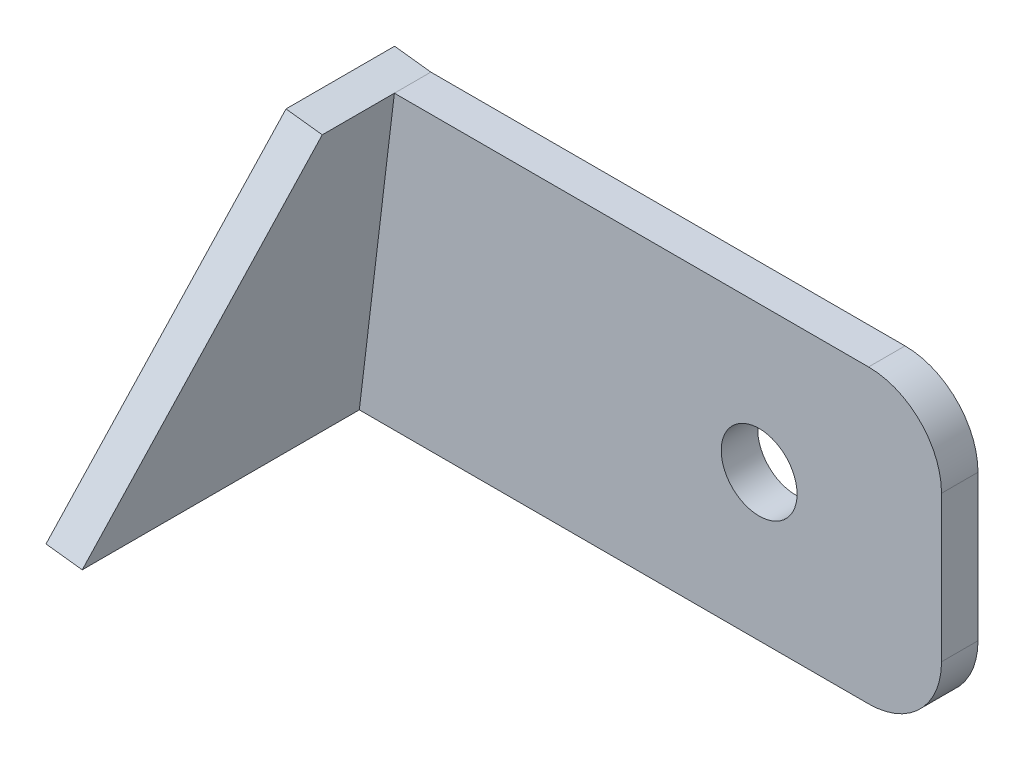
ISO-10303-21;
HEADER;
FILE_DESCRIPTION(('STEP AP214'),'2;1');
FILE_NAME('part.step','',(''),(''),'','','');
FILE_SCHEMA(('AUTOMOTIVE_DESIGN { 1 0 10303 214 1 1 1 1 }'));
ENDSEC;
DATA;
#1=APPLICATION_CONTEXT('core data for automotive mechanical design processes');
#2=APPLICATION_PROTOCOL_DEFINITION('international standard','automotive_design',2000,#1);
#3=PRODUCT_CONTEXT('',#1,'mechanical');
#4=PRODUCT('Part','Part','',(#3));
#5=PRODUCT_RELATED_PRODUCT_CATEGORY('part','',(#4));
#6=PRODUCT_DEFINITION_FORMATION('','',#4);
#7=PRODUCT_DEFINITION_CONTEXT('part definition',#1,'design');
#8=PRODUCT_DEFINITION('design','',#6,#7);
#9=PRODUCT_DEFINITION_SHAPE('','',#8);
#10=(LENGTH_UNIT() NAMED_UNIT(*) SI_UNIT(.MILLI.,.METRE.));
#11=(NAMED_UNIT(*) PLANE_ANGLE_UNIT() SI_UNIT($,.RADIAN.));
#12=(NAMED_UNIT(*) SI_UNIT($,.STERADIAN.) SOLID_ANGLE_UNIT());
#13=UNCERTAINTY_MEASURE_WITH_UNIT(LENGTH_MEASURE(1.E-05),#10,'distance_accuracy_value','');
#14=(GEOMETRIC_REPRESENTATION_CONTEXT(3) GLOBAL_UNCERTAINTY_ASSIGNED_CONTEXT((#13)) GLOBAL_UNIT_ASSIGNED_CONTEXT((#10,
#11,#12)) REPRESENTATION_CONTEXT('',''));
#15=CARTESIAN_POINT('',(0.,0.,0.));
#16=DIRECTION('',(0.,0.,1.));
#17=DIRECTION('',(1.,0.,0.));
#18=AXIS2_PLACEMENT_3D('',#15,#16,#17);
#19=CARTESIAN_POINT('',(-6.20358605111973,-12.3213163244714,0.));
#20=DIRECTION('',(0.119270448985395,0.992861803071718,0.));
#21=DIRECTION('',(-0.992861803071718,0.119270448985395,0.));
#22=AXIS2_PLACEMENT_3D('',#19,#20,#21);
#23=PLANE('',#22);
#24=DIRECTION('',(0.,0.,1.));
#25=VECTOR('',#24,1.);
#26=CARTESIAN_POINT('',(-3.05124982636702,-12.7,0.));
#27=LINE('',#26,#25);
#28=CARTESIAN_POINT('',(-3.05124982636702,-12.7,0.));
#29=VERTEX_POINT('',#28);
#30=CARTESIAN_POINT('',(-3.05124982636702,-12.7,27.2953089126241));
#31=VERTEX_POINT('',#30);
#32=EDGE_CURVE('E209',#29,#31,#27,.T.);
#33=ORIENTED_EDGE('',*,*,#32,.T.);
#34=DIRECTION('',(0.992861803071718,-0.119270448985395,0.));
#35=VECTOR('',#34,1.);
#36=CARTESIAN_POINT('',(-6.20358605111973,-12.3213163244714,27.2953089126241));
#37=LINE('',#36,#35);
#38=CARTESIAN_POINT('',(-6.20358605111973,-12.3213163244714,27.2953089126241));
#39=VERTEX_POINT('',#38);
#40=EDGE_CURVE('E13',#39,#31,#37,.T.);
#41=ORIENTED_EDGE('',*,*,#40,.F.);
#42=DIRECTION('',(0.,0.,1.));
#43=VECTOR('',#42,1.);
#44=CARTESIAN_POINT('',(-6.20358605111973,-12.3213163244714,0.));
#45=LINE('',#44,#43);
#46=CARTESIAN_POINT('',(-6.20358605111973,-12.3213163244714,0.));
#47=VERTEX_POINT('',#46);
#48=EDGE_CURVE('E115',#47,#39,#45,.T.);
#49=ORIENTED_EDGE('',*,*,#48,.F.);
#50=DIRECTION('',(0.992861803071718,-0.119270448985395,0.));
#51=VECTOR('',#50,1.);
#52=CARTESIAN_POINT('',(-6.20358605111973,-12.3213163244714,0.));
#53=LINE('',#52,#51);
#54=EDGE_CURVE('E153',#47,#29,#53,.T.);
#55=ORIENTED_EDGE('',*,*,#54,.T.);
#56=EDGE_LOOP('',(#33,#41,#49,#55));
#57=FACE_BOUND('',#56,.T.);
#58=ADVANCED_FACE('F59',(#57),#23,.F.);
#59=CARTESIAN_POINT('',(-3.63508992450489,9.06002094009953,12.276588008054));
#60=DIRECTION('',(0.0682268201061862,0.567951275481261,0.820229510379508));
#61=DIRECTION('',(0.,-0.822145243895806,0.569277786269151));
#62=AXIS2_PLACEMENT_3D('',#59,#60,#61);
#63=PLANE('',#62);
#64=DIRECTION('',(-0.0978291419740346,-0.81437455060803,0.572034570898117));
#65=VECTOR('',#64,1.);
#66=CARTESIAN_POINT('',(-0.482753699752187,8.6813372645709,12.276588008054));
#67=LINE('',#66,#65);
#68=CARTESIAN_POINT('',(0.,12.7,9.45379103861392));
#69=VERTEX_POINT('',#68);
#70=EDGE_CURVE('E204',#69,#31,#67,.T.);
#71=ORIENTED_EDGE('',*,*,#70,.F.);
#72=DIRECTION('',(0.992861803071718,-0.119270448985395,0.));
#73=VECTOR('',#72,1.);
#74=CARTESIAN_POINT('',(-3.1523362247527,13.0786836755286,9.45379103861392));
#75=LINE('',#74,#73);
#76=CARTESIAN_POINT('',(-3.1523362247527,13.0786836755286,9.45379103861392));
#77=VERTEX_POINT('',#76);
#78=EDGE_CURVE('E67',#77,#69,#75,.T.);
#79=ORIENTED_EDGE('',*,*,#78,.F.);
#80=DIRECTION('',(-0.0978291419740346,-0.81437455060803,0.572034570898117));
#81=VECTOR('',#80,1.);
#82=CARTESIAN_POINT('',(-3.63508992450489,9.06002094009953,12.276588008054));
#83=LINE('',#82,#81);
#84=EDGE_CURVE('E175',#77,#39,#83,.T.);
#85=ORIENTED_EDGE('',*,*,#84,.T.);
#86=ORIENTED_EDGE('',*,*,#40,.T.);
#87=EDGE_LOOP('',(#71,#79,#85,#86));
#88=FACE_BOUND('',#87,.T.);
#89=ADVANCED_FACE('F205',(#88),#63,.T.);
#90=CARTESIAN_POINT('',(-3.1523362247527,13.0786836755286,0.));
#91=DIRECTION('',(0.119270448985395,0.992861803071718,0.));
#92=DIRECTION('',(-0.992861803071718,0.119270448985395,0.));
#93=AXIS2_PLACEMENT_3D('',#90,#91,#92);
#94=PLANE('',#93);
#95=DIRECTION('',(0.,0.,1.));
#96=VECTOR('',#95,1.);
#97=CARTESIAN_POINT('',(0.,12.7,0.));
#98=LINE('',#97,#96);
#99=CARTESIAN_POINT('',(0.,12.7,0.));
#100=VERTEX_POINT('',#99);
#101=EDGE_CURVE('E200',#100,#69,#98,.T.);
#102=ORIENTED_EDGE('',*,*,#101,.F.);
#103=DIRECTION('',(0.992861803071718,-0.119270448985395,0.));
#104=VECTOR('',#103,1.);
#105=CARTESIAN_POINT('',(-3.1523362247527,13.0786836755286,0.));
#106=LINE('',#105,#104);
#107=CARTESIAN_POINT('',(-3.1523362247527,13.0786836755286,0.));
#108=VERTEX_POINT('',#107);
#109=EDGE_CURVE('E194',#108,#100,#106,.T.);
#110=ORIENTED_EDGE('',*,*,#109,.F.);
#111=DIRECTION('',(0.,0.,1.));
#112=VECTOR('',#111,1.);
#113=CARTESIAN_POINT('',(-3.1523362247527,13.0786836755286,0.));
#114=LINE('',#113,#112);
#115=EDGE_CURVE('E170',#108,#77,#114,.T.);
#116=ORIENTED_EDGE('',*,*,#115,.T.);
#117=ORIENTED_EDGE('',*,*,#78,.T.);
#118=EDGE_LOOP('',(#102,#110,#116,#117));
#119=FACE_BOUND('',#118,.T.);
#120=ADVANCED_FACE('F198',(#119),#94,.T.);
#121=CARTESIAN_POINT('',(-4.65625845226942,0.559346763543585,0.));
#122=DIRECTION('',(0.,0.,1.));
#123=DIRECTION('',(1.,0.,0.));
#124=AXIS2_PLACEMENT_3D('',#121,#122,#123);
#125=PLANE('',#124);
#126=DIRECTION('',(-0.119270448985395,-0.992861803071718,0.));
#127=VECTOR('',#126,1.);
#128=CARTESIAN_POINT('',(-1.50392222751671,0.180663088014956,0.));
#129=LINE('',#128,#127);
#130=CARTESIAN_POINT('',(-0.764941024567826,6.33228082599954,0.));
#131=VERTEX_POINT('',#130);
#132=EDGE_CURVE('E214',#100,#131,#129,.T.);
#133=ORIENTED_EDGE('',*,*,#132,.T.);
#134=DIRECTION('',(0.992861803071718,-0.119270448985395,0.));
#135=VECTOR('',#134,1.);
#136=CARTESIAN_POINT('',(-3.91727724932053,6.71096450152817,0.));
#137=LINE('',#136,#135);
#138=CARTESIAN_POINT('',(-3.91727724932053,6.71096450152817,0.));
#139=VERTEX_POINT('',#138);
#140=EDGE_CURVE('E191',#139,#131,#137,.T.);
#141=ORIENTED_EDGE('',*,*,#140,.F.);
#142=DIRECTION('',(-0.119270448985395,-0.992861803071718,0.));
#143=VECTOR('',#142,1.);
#144=CARTESIAN_POINT('',(-4.65625845226942,0.559346763543585,0.));
#145=LINE('',#144,#143);
#146=EDGE_CURVE('E166',#108,#139,#145,.T.);
#147=ORIENTED_EDGE('',*,*,#146,.F.);
#148=ORIENTED_EDGE('',*,*,#109,.T.);
#149=EDGE_LOOP('',(#133,#141,#147,#148));
#150=FACE_BOUND('',#149,.T.);
#151=ADVANCED_FACE('F240',(#150),#125,.F.);
#152=CARTESIAN_POINT('',(-3.91727724932053,6.71096450152817,0.));
#153=DIRECTION('',(0.119270448985395,0.992861803071718,0.));
#154=DIRECTION('',(-0.992861803071718,0.119270448985395,0.));
#155=AXIS2_PLACEMENT_3D('',#152,#153,#154);
#156=PLANE('',#155);
#157=DIRECTION('',(0.,0.,1.));
#158=VECTOR('',#157,1.);
#159=CARTESIAN_POINT('',(-0.764941024567826,6.33228082599954,0.));
#160=LINE('',#159,#158);
#161=CARTESIAN_POINT('',(-0.764941024567826,6.33228082599954,3.175));
#162=VERTEX_POINT('',#161);
#163=EDGE_CURVE('E216',#131,#162,#160,.T.);
#164=ORIENTED_EDGE('',*,*,#163,.T.);
#165=DIRECTION('',(0.992861803071718,-0.119270448985395,0.));
#166=VECTOR('',#165,1.);
#167=CARTESIAN_POINT('',(-3.91727724932053,6.71096450152817,3.175));
#168=LINE('',#167,#166);
#169=CARTESIAN_POINT('',(-3.91727724932053,6.71096450152817,3.175));
#170=VERTEX_POINT('',#169);
#171=EDGE_CURVE('E146',#170,#162,#168,.T.);
#172=ORIENTED_EDGE('',*,*,#171,.F.);
#173=DIRECTION('',(0.,0.,1.));
#174=VECTOR('',#173,1.);
#175=CARTESIAN_POINT('',(-3.91727724932053,6.71096450152817,0.));
#176=LINE('',#175,#174);
#177=EDGE_CURVE('E136',#139,#170,#176,.T.);
#178=ORIENTED_EDGE('',*,*,#177,.F.);
#179=ORIENTED_EDGE('',*,*,#140,.T.);
#180=EDGE_LOOP('',(#164,#172,#178,#179));
#181=FACE_BOUND('',#180,.T.);
#182=ADVANCED_FACE('F220',(#181),#156,.F.);
#183=CARTESIAN_POINT('',(-4.65625845226942,0.559346763543586,3.175));
#184=DIRECTION('',(0.,0.,1.));
#185=DIRECTION('',(0.,-1.,0.));
#186=AXIS2_PLACEMENT_3D('',#183,#184,#185);
#187=PLANE('',#186);
#188=DIRECTION('',(-0.119270448985395,-0.992861803071718,0.));
#189=VECTOR('',#188,1.);
#190=CARTESIAN_POINT('',(-1.50392222751671,0.180663088014957,3.175));
#191=LINE('',#190,#189);
#192=CARTESIAN_POINT('',(-2.28630880179919,-6.33228082599955,3.175));
#193=VERTEX_POINT('',#192);
#194=EDGE_CURVE('E145',#162,#193,#191,.T.);
#195=ORIENTED_EDGE('',*,*,#194,.T.);
#196=DIRECTION('',(0.992861803071718,-0.119270448985395,0.));
#197=VECTOR('',#196,1.);
#198=CARTESIAN_POINT('',(-5.4386450265519,-5.95359715047092,3.175));
#199=LINE('',#198,#197);
#200=CARTESIAN_POINT('',(-5.4386450265519,-5.95359715047092,3.175));
#201=VERTEX_POINT('',#200);
#202=EDGE_CURVE('E142',#201,#193,#199,.T.);
#203=ORIENTED_EDGE('',*,*,#202,.F.);
#204=DIRECTION('',(-0.119270448985395,-0.992861803071718,0.));
#205=VECTOR('',#204,1.);
#206=CARTESIAN_POINT('',(-4.65625845226942,0.559346763543586,3.175));
#207=LINE('',#206,#205);
#208=EDGE_CURVE('E130',#170,#201,#207,.T.);
#209=ORIENTED_EDGE('',*,*,#208,.F.);
#210=ORIENTED_EDGE('',*,*,#171,.T.);
#211=EDGE_LOOP('',(#195,#203,#209,#210));
#212=FACE_BOUND('',#211,.T.);
#213=ADVANCED_FACE('F143',(#212),#187,.F.);
#214=CARTESIAN_POINT('',(-5.4386450265519,-5.95359715047091,0.));
#215=DIRECTION('',(-0.119270448985395,-0.992861803071718,0.));
#216=DIRECTION('',(0.992861803071718,-0.119270448985395,0.));
#217=AXIS2_PLACEMENT_3D('',#214,#215,#216);
#218=PLANE('',#217);
#219=DIRECTION('',(0.,0.,-1.));
#220=VECTOR('',#219,1.);
#221=CARTESIAN_POINT('',(-2.28630880179919,-6.33228082599954,0.));
#222=LINE('',#221,#220);
#223=CARTESIAN_POINT('',(-2.28630880179919,-6.33228082599954,0.));
#224=VERTEX_POINT('',#223);
#225=EDGE_CURVE('E103',#193,#224,#222,.T.);
#226=ORIENTED_EDGE('',*,*,#225,.T.);
#227=DIRECTION('',(0.992861803071718,-0.119270448985395,0.));
#228=VECTOR('',#227,1.);
#229=CARTESIAN_POINT('',(-5.4386450265519,-5.95359715047092,0.));
#230=LINE('',#229,#228);
#231=CARTESIAN_POINT('',(-5.4386450265519,-5.95359715047092,0.));
#232=VERTEX_POINT('',#231);
#233=EDGE_CURVE('E147',#232,#224,#230,.T.);
#234=ORIENTED_EDGE('',*,*,#233,.F.);
#235=DIRECTION('',(0.,0.,-1.));
#236=VECTOR('',#235,1.);
#237=CARTESIAN_POINT('',(-5.4386450265519,-5.95359715047091,0.));
#238=LINE('',#237,#236);
#239=EDGE_CURVE('E134',#201,#232,#238,.T.);
#240=ORIENTED_EDGE('',*,*,#239,.F.);
#241=ORIENTED_EDGE('',*,*,#202,.T.);
#242=EDGE_LOOP('',(#226,#234,#240,#241));
#243=FACE_BOUND('',#242,.T.);
#244=ADVANCED_FACE('F149',(#243),#218,.F.);
#245=CARTESIAN_POINT('',(-4.65625845226942,0.559346763543585,0.));
#246=DIRECTION('',(0.,0.,1.));
#247=DIRECTION('',(1.,0.,0.));
#248=AXIS2_PLACEMENT_3D('',#245,#246,#247);
#249=PLANE('',#248);
#250=DIRECTION('',(-0.119270448985395,-0.992861803071718,0.));
#251=VECTOR('',#250,1.);
#252=CARTESIAN_POINT('',(-1.50392222751671,0.180663088014956,0.));
#253=LINE('',#252,#251);
#254=EDGE_CURVE('E109',#224,#29,#253,.T.);
#255=ORIENTED_EDGE('',*,*,#254,.T.);
#256=ORIENTED_EDGE('',*,*,#54,.F.);
#257=DIRECTION('',(-0.119270448985395,-0.992861803071718,0.));
#258=VECTOR('',#257,1.);
#259=CARTESIAN_POINT('',(-4.65625845226942,0.559346763543585,0.));
#260=LINE('',#259,#258);
#261=EDGE_CURVE('E75',#232,#47,#260,.T.);
#262=ORIENTED_EDGE('',*,*,#261,.F.);
#263=ORIENTED_EDGE('',*,*,#233,.T.);
#264=EDGE_LOOP('',(#255,#256,#262,#263));
#265=FACE_BOUND('',#264,.T.);
#266=ADVANCED_FACE('F223',(#265),#249,.F.);
#267=CARTESIAN_POINT('',(-4.65625845226942,0.559346763543585,0.));
#268=DIRECTION('',(-0.992861803071718,0.119270448985395,0.));
#269=DIRECTION('',(-0.119270448985395,-0.992861803071718,0.));
#270=AXIS2_PLACEMENT_3D('',#267,#268,#269);
#271=PLANE('',#270);
#272=ORIENTED_EDGE('',*,*,#48,.T.);
#273=ORIENTED_EDGE('',*,*,#84,.F.);
#274=ORIENTED_EDGE('',*,*,#115,.F.);
#275=ORIENTED_EDGE('',*,*,#146,.T.);
#276=ORIENTED_EDGE('',*,*,#177,.T.);
#277=ORIENTED_EDGE('',*,*,#208,.T.);
#278=ORIENTED_EDGE('',*,*,#239,.T.);
#279=ORIENTED_EDGE('',*,*,#261,.T.);
#280=EDGE_LOOP('',(#272,#273,#274,#275,#276,#277,#278,#279));
#281=FACE_BOUND('',#280,.T.);
#282=ADVANCED_FACE('F132',(#281),#271,.T.);
#283=CARTESIAN_POINT('',(-1.50392222751671,0.180663088014956,0.));
#284=DIRECTION('',(-0.992861803071718,0.119270448985395,0.));
#285=DIRECTION('',(-0.119270448985395,-0.992861803071718,0.));
#286=AXIS2_PLACEMENT_3D('',#283,#284,#285);
#287=PLANE('',#286);
#288=ORIENTED_EDGE('',*,*,#32,.F.);
#289=ORIENTED_EDGE('',*,*,#254,.F.);
#290=ORIENTED_EDGE('',*,*,#225,.F.);
#291=ORIENTED_EDGE('',*,*,#194,.F.);
#292=ORIENTED_EDGE('',*,*,#163,.F.);
#293=ORIENTED_EDGE('',*,*,#132,.F.);
#294=ORIENTED_EDGE('',*,*,#101,.T.);
#295=ORIENTED_EDGE('',*,*,#70,.T.);
#296=EDGE_LOOP('',(#288,#289,#290,#291,#292,#293,#294,#295));
#297=FACE_BOUND('',#296,.T.);
#298=ADVANCED_FACE('F212',(#297),#287,.F.);
#299=CLOSED_SHELL('',(#58,#89,#120,#151,#182,#213,#244,#266,#282,#298));
#300=MANIFOLD_SOLID_BREP('B2',#299);
#301=CARTESIAN_POINT('',(-1.50392222751671,0.180663088014956,3.175));
#302=DIRECTION('',(0.992861803071718,-0.119270448985395,0.));
#303=DIRECTION('',(0.119270448985395,0.992861803071718,0.));
#304=AXIS2_PLACEMENT_3D('',#301,#302,#303);
#305=PLANE('',#304);
#306=DIRECTION('',(-0.119270448985395,-0.992861803071718,0.));
#307=VECTOR('',#306,1.);
#308=CARTESIAN_POINT('',(-1.50392222751671,0.180663088014956,0.));
#309=LINE('',#308,#307);
#310=CARTESIAN_POINT('',(0.,12.7,0.));
#311=VERTEX_POINT('',#310);
#312=CARTESIAN_POINT('',(-0.78008837158897,6.20618737700943,0.));
#313=VERTEX_POINT('',#312);
#314=EDGE_CURVE('E427',#311,#313,#309,.T.);
#315=ORIENTED_EDGE('',*,*,#314,.T.);
#316=DIRECTION('',(0.,0.,-1.));
#317=VECTOR('',#316,1.);
#318=CARTESIAN_POINT('',(-0.78008837158897,6.20618737700943,3.175));
#319=LINE('',#318,#317);
#320=CARTESIAN_POINT('',(-0.78008837158897,6.20618737700943,3.175));
#321=VERTEX_POINT('',#320);
#322=EDGE_CURVE('E411',#321,#313,#319,.T.);
#323=ORIENTED_EDGE('',*,*,#322,.F.);
#324=DIRECTION('',(-0.119270448985395,-0.992861803071718,0.));
#325=VECTOR('',#324,1.);
#326=CARTESIAN_POINT('',(-1.50392222751671,0.180663088014956,3.175));
#327=LINE('',#326,#325);
#328=CARTESIAN_POINT('',(0.,12.7,3.175));
#329=VERTEX_POINT('',#328);
#330=EDGE_CURVE('E417',#329,#321,#327,.T.);
#331=ORIENTED_EDGE('',*,*,#330,.F.);
#332=DIRECTION('',(0.,0.,-1.));
#333=VECTOR('',#332,1.);
#334=CARTESIAN_POINT('',(0.,12.7,3.175));
#335=LINE('',#334,#333);
#336=EDGE_CURVE('E508',#329,#311,#335,.T.);
#337=ORIENTED_EDGE('',*,*,#336,.T.);
#338=EDGE_LOOP('',(#315,#323,#331,#337));
#339=FACE_BOUND('',#338,.T.);
#340=ADVANCED_FACE('F325',(#339),#305,.F.);
#341=CARTESIAN_POINT('',(0.723833855927744,6.02552428899447,3.175));
#342=DIRECTION('',(-0.119270448985395,-0.992861803071718,0.));
#343=DIRECTION('',(0.992861803071718,-0.119270448985395,0.));
#344=AXIS2_PLACEMENT_3D('',#341,#342,#343);
#345=PLANE('',#344);
#346=DIRECTION('',(-0.992861803071718,0.119270448985395,0.));
#347=VECTOR('',#346,1.);
#348=CARTESIAN_POINT('',(0.723833855927744,6.02552428899447,0.));
#349=LINE('',#348,#347);
#350=CARTESIAN_POINT('',(-3.93242459634167,6.58487105253806,0.));
#351=VERTEX_POINT('',#350);
#352=EDGE_CURVE('E491',#313,#351,#349,.T.);
#353=ORIENTED_EDGE('',*,*,#352,.T.);
#354=DIRECTION('',(0.,0.,-1.));
#355=VECTOR('',#354,1.);
#356=CARTESIAN_POINT('',(-3.93242459634167,6.58487105253806,3.175));
#357=LINE('',#356,#355);
#358=CARTESIAN_POINT('',(-3.93242459634167,6.58487105253806,3.175));
#359=VERTEX_POINT('',#358);
#360=EDGE_CURVE('E413',#359,#351,#357,.T.);
#361=ORIENTED_EDGE('',*,*,#360,.F.);
#362=DIRECTION('',(-0.992861803071718,0.119270448985395,0.));
#363=VECTOR('',#362,1.);
#364=CARTESIAN_POINT('',(0.723833855927744,6.02552428899447,3.175));
#365=LINE('',#364,#363);
#366=EDGE_CURVE('E406',#321,#359,#365,.T.);
#367=ORIENTED_EDGE('',*,*,#366,.F.);
#368=ORIENTED_EDGE('',*,*,#322,.T.);
#369=EDGE_LOOP('',(#353,#361,#367,#368));
#370=FACE_BOUND('',#369,.T.);
#371=ADVANCED_FACE('F409',(#370),#345,.F.);
#372=CARTESIAN_POINT('',(-4.65625845226942,0.559346763543587,3.175));
#373=DIRECTION('',(-0.992861803071718,0.119270448985395,0.));
#374=DIRECTION('',(-0.119270448985395,-0.992861803071718,0.));
#375=AXIS2_PLACEMENT_3D('',#372,#373,#374);
#376=PLANE('',#375);
#377=DIRECTION('',(0.119270448985395,0.992861803071718,0.));
#378=VECTOR('',#377,1.);
#379=CARTESIAN_POINT('',(-4.65625845226942,0.559346763543587,0.));
#380=LINE('',#379,#378);
#381=CARTESIAN_POINT('',(-5.42349767953075,-5.8275037014808,0.));
#382=VERTEX_POINT('',#381);
#383=EDGE_CURVE('E496',#382,#351,#380,.T.);
#384=ORIENTED_EDGE('',*,*,#383,.F.);
#385=DIRECTION('',(0.,0.,-1.));
#386=VECTOR('',#385,1.);
#387=CARTESIAN_POINT('',(-5.42349767953075,-5.8275037014808,3.175));
#388=LINE('',#387,#386);
#389=CARTESIAN_POINT('',(-5.42349767953075,-5.8275037014808,3.175));
#390=VERTEX_POINT('',#389);
#391=EDGE_CURVE('E432',#390,#382,#388,.T.);
#392=ORIENTED_EDGE('',*,*,#391,.F.);
#393=DIRECTION('',(0.119270448985395,0.992861803071718,0.));
#394=VECTOR('',#393,1.);
#395=CARTESIAN_POINT('',(-4.65625845226942,0.559346763543587,3.175));
#396=LINE('',#395,#394);
#397=EDGE_CURVE('E416',#390,#359,#396,.T.);
#398=ORIENTED_EDGE('',*,*,#397,.T.);
#399=ORIENTED_EDGE('',*,*,#360,.T.);
#400=EDGE_LOOP('',(#384,#392,#398,#399));
#401=FACE_BOUND('',#400,.T.);
#402=ADVANCED_FACE('F523',(#401),#376,.T.);
#403=CARTESIAN_POINT('',(-0.767239227261334,-6.38685046502439,3.175));
#404=DIRECTION('',(-0.119270448985395,-0.992861803071718,0.));
#405=DIRECTION('',(0.992861803071718,-0.119270448985395,0.));
#406=AXIS2_PLACEMENT_3D('',#403,#404,#405);
#407=PLANE('',#406);
#408=DIRECTION('',(-0.992861803071718,0.119270448985395,0.));
#409=VECTOR('',#408,1.);
#410=CARTESIAN_POINT('',(-0.767239227261334,-6.38685046502439,0.));
#411=LINE('',#410,#409);
#412=CARTESIAN_POINT('',(-2.27116145477805,-6.20618737700943,0.));
#413=VERTEX_POINT('',#412);
#414=EDGE_CURVE('E474',#413,#382,#411,.T.);
#415=ORIENTED_EDGE('',*,*,#414,.F.);
#416=DIRECTION('',(0.,0.,-1.));
#417=VECTOR('',#416,1.);
#418=CARTESIAN_POINT('',(-2.27116145477805,-6.20618737700943,3.175));
#419=LINE('',#418,#417);
#420=CARTESIAN_POINT('',(-2.27116145477805,-6.20618737700943,3.175));
#421=VERTEX_POINT('',#420);
#422=EDGE_CURVE('E515',#421,#413,#419,.T.);
#423=ORIENTED_EDGE('',*,*,#422,.F.);
#424=DIRECTION('',(-0.992861803071718,0.119270448985395,0.));
#425=VECTOR('',#424,1.);
#426=CARTESIAN_POINT('',(-0.767239227261334,-6.38685046502439,3.175));
#427=LINE('',#426,#425);
#428=EDGE_CURVE('E521',#421,#390,#427,.T.);
#429=ORIENTED_EDGE('',*,*,#428,.T.);
#430=ORIENTED_EDGE('',*,*,#391,.T.);
#431=EDGE_LOOP('',(#415,#423,#429,#430));
#432=FACE_BOUND('',#431,.T.);
#433=ADVANCED_FACE('F519',(#432),#407,.T.);
#434=CARTESIAN_POINT('',(-3.05124982636702,-12.7,0.));
#435=VERTEX_POINT('',#434);
#436=EDGE_CURVE('E469',#413,#435,#309,.T.);
#437=ORIENTED_EDGE('',*,*,#436,.T.);
#438=DIRECTION('',(0.,0.,-1.));
#439=VECTOR('',#438,1.);
#440=CARTESIAN_POINT('',(-3.05124982636702,-12.7,3.175));
#441=LINE('',#440,#439);
#442=CARTESIAN_POINT('',(-3.05124982636702,-12.7,3.175));
#443=VERTEX_POINT('',#442);
#444=EDGE_CURVE('E467',#443,#435,#441,.T.);
#445=ORIENTED_EDGE('',*,*,#444,.F.);
#446=EDGE_CURVE('E425',#421,#443,#327,.T.);
#447=ORIENTED_EDGE('',*,*,#446,.F.);
#448=ORIENTED_EDGE('',*,*,#422,.T.);
#449=EDGE_LOOP('',(#437,#445,#447,#448));
#450=FACE_BOUND('',#449,.T.);
#451=ADVANCED_FACE('F525',(#450),#305,.F.);
#452=CARTESIAN_POINT('',(0.,-12.7,3.175));
#453=DIRECTION('',(0.,1.,0.));
#454=DIRECTION('',(-1.,0.,0.));
#455=AXIS2_PLACEMENT_3D('',#452,#453,#454);
#456=PLANE('',#455);
#457=DIRECTION('',(1.,0.,0.));
#458=VECTOR('',#457,1.);
#459=CARTESIAN_POINT('',(0.,-12.7,0.));
#460=LINE('',#459,#458);
#461=CARTESIAN_POINT('',(41.275,-12.7,0.));
#462=VERTEX_POINT('',#461);
#463=EDGE_CURVE('E462',#435,#462,#460,.T.);
#464=ORIENTED_EDGE('',*,*,#463,.T.);
#465=DIRECTION('',(0.,0.,-1.));
#466=VECTOR('',#465,1.);
#467=CARTESIAN_POINT('',(41.275,-12.7,3.175));
#468=LINE('',#467,#466);
#469=CARTESIAN_POINT('',(41.275,-12.7,3.175));
#470=VERTEX_POINT('',#469);
#471=EDGE_CURVE('E348',#462,#470,#468,.F.);
#472=ORIENTED_EDGE('',*,*,#471,.T.);
#473=DIRECTION('',(1.,0.,0.));
#474=VECTOR('',#473,1.);
#475=CARTESIAN_POINT('',(0.,-12.7,3.175));
#476=LINE('',#475,#474);
#477=EDGE_CURVE('E448',#443,#470,#476,.T.);
#478=ORIENTED_EDGE('',*,*,#477,.F.);
#479=ORIENTED_EDGE('',*,*,#444,.T.);
#480=EDGE_LOOP('',(#464,#472,#478,#479));
#481=FACE_BOUND('',#480,.T.);
#482=ADVANCED_FACE('F465',(#481),#456,.F.);
#483=CARTESIAN_POINT('',(47.625,0.,3.175));
#484=DIRECTION('',(1.,0.,0.));
#485=DIRECTION('',(0.,0.,-1.));
#486=AXIS2_PLACEMENT_3D('',#483,#484,#485);
#487=PLANE('',#486);
#488=DIRECTION('',(0.,-1.,0.));
#489=VECTOR('',#488,1.);
#490=CARTESIAN_POINT('',(47.625,0.,3.175));
#491=LINE('',#490,#489);
#492=CARTESIAN_POINT('',(47.625,6.35,3.175));
#493=VERTEX_POINT('',#492);
#494=CARTESIAN_POINT('',(47.625,-6.34999999999998,3.175));
#495=VERTEX_POINT('',#494);
#496=EDGE_CURVE('E447',#493,#495,#491,.T.);
#497=ORIENTED_EDGE('',*,*,#496,.T.);
#498=DIRECTION('',(0.,0.,-1.));
#499=VECTOR('',#498,1.);
#500=CARTESIAN_POINT('',(47.625,-6.34999999999998,0.));
#501=LINE('',#500,#499);
#502=CARTESIAN_POINT('',(47.625,-6.34999999999998,0.));
#503=VERTEX_POINT('',#502);
#504=EDGE_CURVE('E430',#495,#503,#501,.T.);
#505=ORIENTED_EDGE('',*,*,#504,.T.);
#506=DIRECTION('',(0.,-1.,0.));
#507=VECTOR('',#506,1.);
#508=CARTESIAN_POINT('',(47.625,0.,0.));
#509=LINE('',#508,#507);
#510=CARTESIAN_POINT('',(47.625,6.35,0.));
#511=VERTEX_POINT('',#510);
#512=EDGE_CURVE('E463',#511,#503,#509,.T.);
#513=ORIENTED_EDGE('',*,*,#512,.F.);
#514=DIRECTION('',(0.,0.,-1.));
#515=VECTOR('',#514,1.);
#516=CARTESIAN_POINT('',(47.625,6.35,3.175));
#517=LINE('',#516,#515);
#518=EDGE_CURVE('E428',#511,#493,#517,.F.);
#519=ORIENTED_EDGE('',*,*,#518,.T.);
#520=EDGE_LOOP('',(#497,#505,#513,#519));
#521=FACE_BOUND('',#520,.T.);
#522=ADVANCED_FACE('F452',(#521),#487,.T.);
#523=CARTESIAN_POINT('',(0.,12.7,3.175));
#524=DIRECTION('',(0.,1.,0.));
#525=DIRECTION('',(0.,0.,1.));
#526=AXIS2_PLACEMENT_3D('',#523,#524,#525);
#527=PLANE('',#526);
#528=DIRECTION('',(1.,0.,0.));
#529=VECTOR('',#528,1.);
#530=CARTESIAN_POINT('',(0.,12.7,3.175));
#531=LINE('',#530,#529);
#532=CARTESIAN_POINT('',(41.275,12.7,3.175));
#533=VERTEX_POINT('',#532);
#534=EDGE_CURVE('E421',#329,#533,#531,.T.);
#535=ORIENTED_EDGE('',*,*,#534,.T.);
#536=DIRECTION('',(0.,0.,-1.));
#537=VECTOR('',#536,1.);
#538=CARTESIAN_POINT('',(41.275,12.7,3.175));
#539=LINE('',#538,#537);
#540=CARTESIAN_POINT('',(41.275,12.7,0.));
#541=VERTEX_POINT('',#540);
#542=EDGE_CURVE('E57',#533,#541,#539,.T.);
#543=ORIENTED_EDGE('',*,*,#542,.T.);
#544=DIRECTION('',(1.,0.,0.));
#545=VECTOR('',#544,1.);
#546=CARTESIAN_POINT('',(0.,12.7,0.));
#547=LINE('',#546,#545);
#548=EDGE_CURVE('E423',#311,#541,#547,.T.);
#549=ORIENTED_EDGE('',*,*,#548,.F.);
#550=ORIENTED_EDGE('',*,*,#336,.F.);
#551=EDGE_LOOP('',(#535,#543,#549,#550));
#552=FACE_BOUND('',#551,.T.);
#553=ADVANCED_FACE('F507',(#552),#527,.T.);
#554=CARTESIAN_POINT('',(0.,0.,3.175));
#555=DIRECTION('',(0.,0.,1.));
#556=DIRECTION('',(1.,0.,0.));
#557=AXIS2_PLACEMENT_3D('',#554,#555,#556);
#558=PLANE('',#557);
#559=CARTESIAN_POINT('',(31.75,0.,3.175));
#560=DIRECTION('',(0.,0.,1.));
#561=DIRECTION('',(1.,0.,0.));
#562=AXIS2_PLACEMENT_3D('',#559,#560,#561);
#563=CIRCLE('',#562,3.302);
#564=CARTESIAN_POINT('',(35.052,0.,3.175));
#565=VERTEX_POINT('',#564);
#566=EDGE_CURVE('E492',#565,#565,#563,.T.);
#567=ORIENTED_EDGE('',*,*,#566,.F.);
#568=EDGE_LOOP('',(#567));
#569=FACE_BOUND('',#568,.T.);
#570=ORIENTED_EDGE('',*,*,#477,.T.);
#571=CARTESIAN_POINT('',(41.275,-6.34999999999998,3.175));
#572=DIRECTION('',(0.,0.,1.));
#573=DIRECTION('',(1.,0.,0.));
#574=AXIS2_PLACEMENT_3D('',#571,#572,#573);
#575=CIRCLE('',#574,6.35);
#576=EDGE_CURVE('E333',#470,#495,#575,.T.);
#577=ORIENTED_EDGE('',*,*,#576,.T.);
#578=ORIENTED_EDGE('',*,*,#496,.F.);
#579=CARTESIAN_POINT('',(41.275,6.35,3.175));
#580=DIRECTION('',(0.,0.,1.));
#581=DIRECTION('',(1.,0.,0.));
#582=AXIS2_PLACEMENT_3D('',#579,#580,#581);
#583=CIRCLE('',#582,6.35);
#584=EDGE_CURVE('E340',#493,#533,#583,.T.);
#585=ORIENTED_EDGE('',*,*,#584,.T.);
#586=ORIENTED_EDGE('',*,*,#534,.F.);
#587=ORIENTED_EDGE('',*,*,#330,.T.);
#588=ORIENTED_EDGE('',*,*,#366,.T.);
#589=ORIENTED_EDGE('',*,*,#397,.F.);
#590=ORIENTED_EDGE('',*,*,#428,.F.);
#591=ORIENTED_EDGE('',*,*,#446,.T.);
#592=EDGE_LOOP('',(#570,#577,#578,#585,#586,#587,#588,#589,#590,#591));
#593=FACE_BOUND('',#592,.T.);
#594=ADVANCED_FACE('F420',(#569,#593),#558,.T.);
#595=CARTESIAN_POINT('',(0.,0.,0.));
#596=DIRECTION('',(0.,0.,1.));
#597=DIRECTION('',(1.,0.,0.));
#598=AXIS2_PLACEMENT_3D('',#595,#596,#597);
#599=PLANE('',#598);
#600=CARTESIAN_POINT('',(31.75,0.,0.));
#601=DIRECTION('',(0.,0.,1.));
#602=DIRECTION('',(1.,0.,0.));
#603=AXIS2_PLACEMENT_3D('',#600,#601,#602);
#604=CIRCLE('',#603,3.302);
#605=CARTESIAN_POINT('',(35.052,0.,0.));
#606=VERTEX_POINT('',#605);
#607=EDGE_CURVE('E533',#606,#606,#604,.T.);
#608=ORIENTED_EDGE('',*,*,#607,.T.);
#609=EDGE_LOOP('',(#608));
#610=FACE_BOUND('',#609,.T.);
#611=ORIENTED_EDGE('',*,*,#512,.T.);
#612=CARTESIAN_POINT('',(41.275,-6.34999999999998,0.));
#613=DIRECTION('',(0.,0.,1.));
#614=DIRECTION('',(1.,0.,0.));
#615=AXIS2_PLACEMENT_3D('',#612,#613,#614);
#616=CIRCLE('',#615,6.35);
#617=EDGE_CURVE('E441',#503,#462,#616,.F.);
#618=ORIENTED_EDGE('',*,*,#617,.T.);
#619=ORIENTED_EDGE('',*,*,#463,.F.);
#620=ORIENTED_EDGE('',*,*,#436,.F.);
#621=ORIENTED_EDGE('',*,*,#414,.T.);
#622=ORIENTED_EDGE('',*,*,#383,.T.);
#623=ORIENTED_EDGE('',*,*,#352,.F.);
#624=ORIENTED_EDGE('',*,*,#314,.F.);
#625=ORIENTED_EDGE('',*,*,#548,.T.);
#626=CARTESIAN_POINT('',(41.275,6.35,0.));
#627=DIRECTION('',(0.,0.,1.));
#628=DIRECTION('',(1.,0.,0.));
#629=AXIS2_PLACEMENT_3D('',#626,#627,#628);
#630=CIRCLE('',#629,6.35);
#631=EDGE_CURVE('E438',#541,#511,#630,.F.);
#632=ORIENTED_EDGE('',*,*,#631,.T.);
#633=EDGE_LOOP('',(#611,#618,#619,#620,#621,#622,#623,#624,#625,#632));
#634=FACE_BOUND('',#633,.T.);
#635=ADVANCED_FACE('F460',(#610,#634),#599,.F.);
#636=CARTESIAN_POINT('',(31.75,0.,0.));
#637=DIRECTION('',(0.,0.,1.));
#638=DIRECTION('',(1.,0.,0.));
#639=AXIS2_PLACEMENT_3D('',#636,#637,#638);
#640=CYLINDRICAL_SURFACE('',#639,3.302);
#641=ORIENTED_EDGE('',*,*,#566,.T.);
#642=EDGE_LOOP('',(#641));
#643=FACE_BOUND('',#642,.T.);
#644=ORIENTED_EDGE('',*,*,#607,.F.);
#645=EDGE_LOOP('',(#644));
#646=FACE_BOUND('',#645,.T.);
#647=ADVANCED_FACE('F540',(#643,#646),#640,.F.);
#648=CARTESIAN_POINT('',(41.275,-6.34999999999998,3.175));
#649=DIRECTION('',(0.,0.,1.));
#650=DIRECTION('',(1.,0.,0.));
#651=AXIS2_PLACEMENT_3D('',#648,#649,#650);
#652=CYLINDRICAL_SURFACE('',#651,6.35);
#653=ORIENTED_EDGE('',*,*,#576,.F.);
#654=ORIENTED_EDGE('',*,*,#471,.F.);
#655=ORIENTED_EDGE('',*,*,#617,.F.);
#656=ORIENTED_EDGE('',*,*,#504,.F.);
#657=EDGE_LOOP('',(#653,#654,#655,#656));
#658=FACE_BOUND('',#657,.T.);
#659=ADVANCED_FACE('F457',(#658),#652,.T.);
#660=CARTESIAN_POINT('',(41.275,6.35,3.175));
#661=DIRECTION('',(0.,0.,-1.));
#662=DIRECTION('',(-1.,0.,0.));
#663=AXIS2_PLACEMENT_3D('',#660,#661,#662);
#664=CYLINDRICAL_SURFACE('',#663,6.35);
#665=ORIENTED_EDGE('',*,*,#584,.F.);
#666=ORIENTED_EDGE('',*,*,#518,.F.);
#667=ORIENTED_EDGE('',*,*,#631,.F.);
#668=ORIENTED_EDGE('',*,*,#542,.F.);
#669=EDGE_LOOP('',(#665,#666,#667,#668));
#670=FACE_BOUND('',#669,.T.);
#671=ADVANCED_FACE('F327',(#670),#664,.T.);
#672=CLOSED_SHELL('',(#340,#371,#402,#433,#451,#482,#522,#553,#594,#635,#647,#659,#671));
#673=MANIFOLD_SOLID_BREP('B7',#672);
#674=ADVANCED_BREP_SHAPE_REPRESENTATION('',(#18,#300,#673),#14);
#675=SHAPE_DEFINITION_REPRESENTATION(#9,#674);
ENDSEC;
END-ISO-10303-21;
